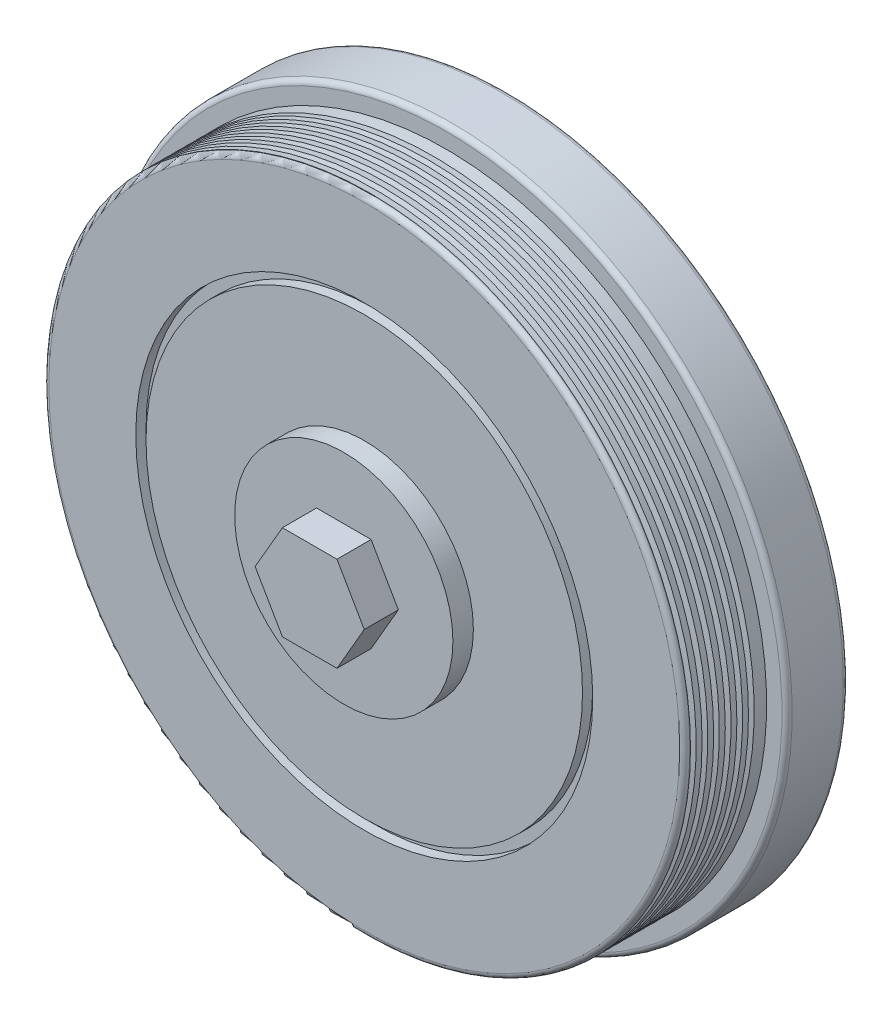
ISO-10303-21;
HEADER;
FILE_DESCRIPTION(('STEP AP214'),'2;1');
FILE_NAME('part.step','',(''),(''),'','','');
FILE_SCHEMA(('AUTOMOTIVE_DESIGN { 1 0 10303 214 1 1 1 1 }'));
ENDSEC;
DATA;
#1=APPLICATION_CONTEXT('core data for automotive mechanical design processes');
#2=APPLICATION_PROTOCOL_DEFINITION('international standard','automotive_design',2000,#1);
#3=PRODUCT_CONTEXT('',#1,'mechanical');
#4=PRODUCT('Part','Part','',(#3));
#5=PRODUCT_RELATED_PRODUCT_CATEGORY('part','',(#4));
#6=PRODUCT_DEFINITION_FORMATION('','',#4);
#7=PRODUCT_DEFINITION_CONTEXT('part definition',#1,'design');
#8=PRODUCT_DEFINITION('design','',#6,#7);
#9=PRODUCT_DEFINITION_SHAPE('','',#8);
#10=(LENGTH_UNIT() NAMED_UNIT(*) SI_UNIT(.MILLI.,.METRE.));
#11=(NAMED_UNIT(*) PLANE_ANGLE_UNIT() SI_UNIT($,.RADIAN.));
#12=(NAMED_UNIT(*) SI_UNIT($,.STERADIAN.) SOLID_ANGLE_UNIT());
#13=UNCERTAINTY_MEASURE_WITH_UNIT(LENGTH_MEASURE(1.E-05),#10,'distance_accuracy_value','');
#14=(GEOMETRIC_REPRESENTATION_CONTEXT(3) GLOBAL_UNCERTAINTY_ASSIGNED_CONTEXT((#13)) GLOBAL_UNIT_ASSIGNED_CONTEXT((#10,
#11,#12)) REPRESENTATION_CONTEXT('',''));
#15=CARTESIAN_POINT('',(0.,0.,0.));
#16=DIRECTION('',(0.,0.,1.));
#17=DIRECTION('',(1.,0.,0.));
#18=AXIS2_PLACEMENT_3D('',#15,#16,#17);
#19=CARTESIAN_POINT('',(0.,92.5,140.));
#20=DIRECTION('',(0.,0.,1.));
#21=DIRECTION('',(1.,0.,0.));
#22=AXIS2_PLACEMENT_3D('',#19,#20,#21);
#23=PLANE('',#22);
#24=CARTESIAN_POINT('',(0.,0.,140.));
#25=DIRECTION('',(0.,0.,1.));
#26=DIRECTION('',(1.,0.,0.));
#27=AXIS2_PLACEMENT_3D('',#24,#25,#26);
#28=CIRCLE('',#27,32.);
#29=CARTESIAN_POINT('',(32.,0.,140.));
#30=VERTEX_POINT('',#29);
#31=EDGE_CURVE('E11',#30,#30,#28,.T.);
#32=ORIENTED_EDGE('',*,*,#31,.F.);
#33=EDGE_LOOP('',(#32));
#34=FACE_BOUND('',#33,.T.);
#35=CARTESIAN_POINT('',(0.,0.,140.));
#36=DIRECTION('',(0.,0.,1.));
#37=DIRECTION('',(1.,0.,0.));
#38=AXIS2_PLACEMENT_3D('',#35,#36,#37);
#39=CIRCLE('',#38,64.);
#40=CARTESIAN_POINT('',(64.,0.,140.));
#41=VERTEX_POINT('',#40);
#42=EDGE_CURVE('E44',#41,#41,#39,.F.);
#43=ORIENTED_EDGE('',*,*,#42,.F.);
#44=EDGE_LOOP('',(#43));
#45=FACE_BOUND('',#44,.T.);
#46=ADVANCED_FACE('F41',(#34,#45),#23,.T.);
#47=CARTESIAN_POINT('',(0.,0.,80.));
#48=DIRECTION('',(0.,0.,-1.));
#49=DIRECTION('',(-1.,0.,0.));
#50=AXIS2_PLACEMENT_3D('',#47,#48,#49);
#51=CYLINDRICAL_SURFACE('',#50,94.);
#52=CARTESIAN_POINT('',(0.,0.,119.666666666667));
#53=DIRECTION('',(0.,0.,-1.));
#54=DIRECTION('',(-1.,0.,0.));
#55=AXIS2_PLACEMENT_3D('',#52,#53,#54);
#56=CIRCLE('',#55,94.);
#57=CARTESIAN_POINT('',(-94.,0.,119.666666666667));
#58=VERTEX_POINT('',#57);
#59=EDGE_CURVE('E154',#58,#58,#56,.F.);
#60=ORIENTED_EDGE('',*,*,#59,.F.);
#61=EDGE_LOOP('',(#60));
#62=FACE_BOUND('',#61,.T.);
#63=CARTESIAN_POINT('',(0.,0.,116.));
#64=DIRECTION('',(0.,0.,-1.));
#65=DIRECTION('',(-1.,0.,0.));
#66=AXIS2_PLACEMENT_3D('',#63,#64,#65);
#67=CIRCLE('',#66,94.);
#68=CARTESIAN_POINT('',(-94.,0.,116.));
#69=VERTEX_POINT('',#68);
#70=EDGE_CURVE('E158',#69,#69,#67,.T.);
#71=ORIENTED_EDGE('',*,*,#70,.F.);
#72=EDGE_LOOP('',(#71));
#73=FACE_BOUND('',#72,.T.);
#74=ADVANCED_FACE('F216',(#62,#73),#51,.T.);
#75=CARTESIAN_POINT('',(0.,0.,80.));
#76=DIRECTION('',(0.,0.,-1.));
#77=DIRECTION('',(-1.,0.,0.));
#78=AXIS2_PLACEMENT_3D('',#75,#76,#77);
#79=CYLINDRICAL_SURFACE('',#78,25.05);
#80=CARTESIAN_POINT('',(0.,0.,98.));
#81=DIRECTION('',(0.,0.,-1.));
#82=DIRECTION('',(-1.,0.,0.));
#83=AXIS2_PLACEMENT_3D('',#80,#81,#82);
#84=CIRCLE('',#83,25.05);
#85=CARTESIAN_POINT('',(-25.05,0.,98.));
#86=VERTEX_POINT('',#85);
#87=EDGE_CURVE('E49',#86,#86,#84,.T.);
#88=ORIENTED_EDGE('',*,*,#87,.T.);
#89=EDGE_LOOP('',(#88));
#90=FACE_BOUND('',#89,.T.);
#91=CARTESIAN_POINT('',(0.,0.,140.));
#92=DIRECTION('',(0.,0.,-1.));
#93=DIRECTION('',(-1.,0.,0.));
#94=AXIS2_PLACEMENT_3D('',#91,#92,#93);
#95=CIRCLE('',#94,25.05);
#96=CARTESIAN_POINT('',(-25.05,0.,140.));
#97=VERTEX_POINT('',#96);
#98=EDGE_CURVE('E150',#97,#97,#95,.T.);
#99=ORIENTED_EDGE('',*,*,#98,.F.);
#100=EDGE_LOOP('',(#99));
#101=FACE_BOUND('',#100,.T.);
#102=ADVANCED_FACE('F43',(#90,#101),#79,.F.);
#103=CARTESIAN_POINT('',(0.,25.05,98.));
#104=DIRECTION('',(0.,0.,-1.));
#105=DIRECTION('',(-1.,0.,0.));
#106=AXIS2_PLACEMENT_3D('',#103,#104,#105);
#107=PLANE('',#106);
#108=CARTESIAN_POINT('',(0.,0.,98.));
#109=DIRECTION('',(0.,0.,-1.));
#110=DIRECTION('',(-1.,0.,0.));
#111=AXIS2_PLACEMENT_3D('',#108,#109,#110);
#112=CIRCLE('',#111,98.5);
#113=CARTESIAN_POINT('',(-98.5,0.,98.));
#114=VERTEX_POINT('',#113);
#115=EDGE_CURVE('E175',#114,#114,#112,.T.);
#116=ORIENTED_EDGE('',*,*,#115,.T.);
#117=EDGE_LOOP('',(#116));
#118=FACE_BOUND('',#117,.T.);
#119=ORIENTED_EDGE('',*,*,#87,.F.);
#120=EDGE_LOOP('',(#119));
#121=FACE_BOUND('',#120,.T.);
#122=ADVANCED_FACE('F594',(#118,#121),#107,.T.);
#123=CARTESIAN_POINT('',(0.,0.,99.5));
#124=DIRECTION('',(0.,0.,-1.));
#125=DIRECTION('',(-1.,0.,0.));
#126=AXIS2_PLACEMENT_3D('',#123,#124,#125);
#127=TOROIDAL_SURFACE('',#126,98.5,1.5);
#128=CARTESIAN_POINT('',(0.,0.,99.5));
#129=DIRECTION('',(0.,0.,-1.));
#130=DIRECTION('',(-1.,0.,0.));
#131=AXIS2_PLACEMENT_3D('',#128,#129,#130);
#132=CIRCLE('',#131,100.);
#133=CARTESIAN_POINT('',(-100.,0.,99.5));
#134=VERTEX_POINT('',#133);
#135=EDGE_CURVE('E169',#134,#134,#132,.T.);
#136=ORIENTED_EDGE('',*,*,#135,.T.);
#137=EDGE_LOOP('',(#136));
#138=FACE_BOUND('',#137,.T.);
#139=ORIENTED_EDGE('',*,*,#115,.F.);
#140=EDGE_LOOP('',(#139));
#141=FACE_BOUND('',#140,.T.);
#142=ADVANCED_FACE('F584',(#138,#141),#127,.T.);
#143=CARTESIAN_POINT('',(0.,0.,80.));
#144=DIRECTION('',(0.,0.,-1.));
#145=DIRECTION('',(-1.,0.,0.));
#146=AXIS2_PLACEMENT_3D('',#143,#144,#145);
#147=CYLINDRICAL_SURFACE('',#146,100.);
#148=CARTESIAN_POINT('',(0.,0.,114.5));
#149=DIRECTION('',(0.,0.,-1.));
#150=DIRECTION('',(-1.,0.,0.));
#151=AXIS2_PLACEMENT_3D('',#148,#149,#150);
#152=CIRCLE('',#151,100.);
#153=CARTESIAN_POINT('',(-100.,0.,114.5));
#154=VERTEX_POINT('',#153);
#155=EDGE_CURVE('E168',#154,#154,#152,.T.);
#156=ORIENTED_EDGE('',*,*,#155,.T.);
#157=EDGE_LOOP('',(#156));
#158=FACE_BOUND('',#157,.T.);
#159=ORIENTED_EDGE('',*,*,#135,.F.);
#160=EDGE_LOOP('',(#159));
#161=FACE_BOUND('',#160,.T.);
#162=ADVANCED_FACE('F573',(#158,#161),#147,.T.);
#163=CARTESIAN_POINT('',(0.,0.,114.5));
#164=DIRECTION('',(0.,0.,-1.));
#165=DIRECTION('',(-1.,0.,0.));
#166=AXIS2_PLACEMENT_3D('',#163,#164,#165);
#167=TOROIDAL_SURFACE('',#166,98.5,1.5);
#168=CARTESIAN_POINT('',(0.,0.,116.));
#169=DIRECTION('',(0.,0.,-1.));
#170=DIRECTION('',(-1.,0.,0.));
#171=AXIS2_PLACEMENT_3D('',#168,#169,#170);
#172=CIRCLE('',#171,98.5);
#173=CARTESIAN_POINT('',(-98.5,0.,116.));
#174=VERTEX_POINT('',#173);
#175=EDGE_CURVE('E161',#174,#174,#172,.T.);
#176=ORIENTED_EDGE('',*,*,#175,.T.);
#177=EDGE_LOOP('',(#176));
#178=FACE_BOUND('',#177,.T.);
#179=ORIENTED_EDGE('',*,*,#155,.F.);
#180=EDGE_LOOP('',(#179));
#181=FACE_BOUND('',#180,.T.);
#182=ADVANCED_FACE('F262',(#178,#181),#167,.T.);
#183=CARTESIAN_POINT('',(0.,98.5,116.));
#184=DIRECTION('',(0.,0.,1.));
#185=DIRECTION('',(1.,0.,0.));
#186=AXIS2_PLACEMENT_3D('',#183,#184,#185);
#187=PLANE('',#186);
#188=ORIENTED_EDGE('',*,*,#70,.T.);
#189=EDGE_LOOP('',(#188));
#190=FACE_BOUND('',#189,.T.);
#191=ORIENTED_EDGE('',*,*,#175,.F.);
#192=EDGE_LOOP('',(#191));
#193=FACE_BOUND('',#192,.T.);
#194=ADVANCED_FACE('F253',(#190,#193),#187,.T.);
#195=CARTESIAN_POINT('',(0.,0.,138.333333333333));
#196=DIRECTION('',(0.,0.,1.));
#197=DIRECTION('',(1.,0.,0.));
#198=AXIS2_PLACEMENT_3D('',#195,#196,#197);
#199=CIRCLE('',#198,94.);
#200=CARTESIAN_POINT('',(94.,0.,138.333333333333));
#201=VERTEX_POINT('',#200);
#202=EDGE_CURVE('E134',#201,#201,#199,.F.);
#203=ORIENTED_EDGE('',*,*,#202,.F.);
#204=EDGE_LOOP('',(#203));
#205=FACE_BOUND('',#204,.T.);
#206=CARTESIAN_POINT('',(0.,0.,138.5));
#207=DIRECTION('',(0.,0.,-1.));
#208=DIRECTION('',(-1.,0.,0.));
#209=AXIS2_PLACEMENT_3D('',#206,#207,#208);
#210=CIRCLE('',#209,94.);
#211=CARTESIAN_POINT('',(-94.,0.,138.5));
#212=VERTEX_POINT('',#211);
#213=EDGE_CURVE('E159',#212,#212,#210,.T.);
#214=ORIENTED_EDGE('',*,*,#213,.T.);
#215=EDGE_LOOP('',(#214));
#216=FACE_BOUND('',#215,.T.);
#217=ADVANCED_FACE('F235',(#205,#216),#51,.T.);
#218=CARTESIAN_POINT('',(0.,0.,138.5));
#219=DIRECTION('',(0.,0.,-1.));
#220=DIRECTION('',(-1.,0.,0.));
#221=AXIS2_PLACEMENT_3D('',#218,#219,#220);
#222=TOROIDAL_SURFACE('',#221,92.5,1.5);
#223=CARTESIAN_POINT('',(0.,0.,140.));
#224=DIRECTION('',(0.,0.,-1.));
#225=DIRECTION('',(-1.,0.,0.));
#226=AXIS2_PLACEMENT_3D('',#223,#224,#225);
#227=CIRCLE('',#226,92.5);
#228=CARTESIAN_POINT('',(-92.5,0.,140.));
#229=VERTEX_POINT('',#228);
#230=EDGE_CURVE('E153',#229,#229,#227,.T.);
#231=ORIENTED_EDGE('',*,*,#230,.T.);
#232=EDGE_LOOP('',(#231));
#233=FACE_BOUND('',#232,.T.);
#234=ORIENTED_EDGE('',*,*,#213,.F.);
#235=EDGE_LOOP('',(#234));
#236=FACE_BOUND('',#235,.T.);
#237=ADVANCED_FACE('F238',(#233,#236),#222,.T.);
#238=CARTESIAN_POINT('',(0.,0.,140.));
#239=DIRECTION('',(0.,0.,1.));
#240=DIRECTION('',(1.,0.,0.));
#241=AXIS2_PLACEMENT_3D('',#238,#239,#240);
#242=CIRCLE('',#241,67.);
#243=CARTESIAN_POINT('',(67.,0.,140.));
#244=VERTEX_POINT('',#243);
#245=EDGE_CURVE('E130',#244,#244,#242,.T.);
#246=ORIENTED_EDGE('',*,*,#245,.F.);
#247=EDGE_LOOP('',(#246));
#248=FACE_BOUND('',#247,.T.);
#249=ORIENTED_EDGE('',*,*,#230,.F.);
#250=EDGE_LOOP('',(#249));
#251=FACE_BOUND('',#250,.T.);
#252=ADVANCED_FACE('F225',(#248,#251),#23,.T.);
#253=CARTESIAN_POINT('',(0.,0.,137.5));
#254=DIRECTION('',(0.,0.,-1.));
#255=DIRECTION('',(-1.,0.,0.));
#256=AXIS2_PLACEMENT_3D('',#253,#254,#255);
#257=CONICAL_SURFACE('',#256,91.5,1.24904577239825);
#258=CARTESIAN_POINT('',(0.,0.,136.666666666667));
#259=DIRECTION('',(0.,0.,-1.));
#260=DIRECTION('',(-1.,0.,0.));
#261=AXIS2_PLACEMENT_3D('',#258,#259,#260);
#262=CIRCLE('',#261,94.);
#263=CARTESIAN_POINT('',(-94.,0.,136.666666666667));
#264=VERTEX_POINT('',#263);
#265=EDGE_CURVE('E177',#264,#264,#262,.F.);
#266=ORIENTED_EDGE('',*,*,#265,.T.);
#267=EDGE_LOOP('',(#266));
#268=FACE_BOUND('',#267,.T.);
#269=CARTESIAN_POINT('',(0.,0.,137.5));
#270=DIRECTION('',(0.,0.,-1.));
#271=DIRECTION('',(-1.,0.,0.));
#272=AXIS2_PLACEMENT_3D('',#269,#270,#271);
#273=CIRCLE('',#272,91.5);
#274=CARTESIAN_POINT('',(-91.5,0.,137.5));
#275=VERTEX_POINT('',#274);
#276=EDGE_CURVE('E147',#275,#275,#273,.T.);
#277=ORIENTED_EDGE('',*,*,#276,.T.);
#278=EDGE_LOOP('',(#277));
#279=FACE_BOUND('',#278,.T.);
#280=ADVANCED_FACE('F240',(#268,#279),#257,.T.);
#281=CARTESIAN_POINT('',(0.,0.,139.));
#282=DIRECTION('',(0.,0.,1.));
#283=DIRECTION('',(1.,0.,0.));
#284=AXIS2_PLACEMENT_3D('',#281,#282,#283);
#285=CONICAL_SURFACE('',#284,96.,1.24904577239825);
#286=ORIENTED_EDGE('',*,*,#202,.T.);
#287=EDGE_LOOP('',(#286));
#288=FACE_BOUND('',#287,.T.);
#289=ORIENTED_EDGE('',*,*,#276,.F.);
#290=EDGE_LOOP('',(#289));
#291=FACE_BOUND('',#290,.T.);
#292=ADVANCED_FACE('F244',(#288,#291),#285,.T.);
#293=CARTESIAN_POINT('',(0.,0.,134.933333333333));
#294=DIRECTION('',(0.,0.,1.));
#295=DIRECTION('',(1.,0.,0.));
#296=AXIS2_PLACEMENT_3D('',#293,#294,#295);
#297=CIRCLE('',#296,94.);
#298=CARTESIAN_POINT('',(94.,0.,134.933333333333));
#299=VERTEX_POINT('',#298);
#300=EDGE_CURVE('E185',#299,#299,#297,.F.);
#301=ORIENTED_EDGE('',*,*,#300,.F.);
#302=EDGE_LOOP('',(#301));
#303=FACE_BOUND('',#302,.T.);
#304=ORIENTED_EDGE('',*,*,#265,.F.);
#305=EDGE_LOOP('',(#304));
#306=FACE_BOUND('',#305,.T.);
#307=ADVANCED_FACE('F257',(#303,#306),#51,.T.);
#308=CARTESIAN_POINT('',(0.,0.,134.1));
#309=DIRECTION('',(0.,0.,-1.));
#310=DIRECTION('',(-1.,0.,0.));
#311=AXIS2_PLACEMENT_3D('',#308,#309,#310);
#312=CONICAL_SURFACE('',#311,91.5,1.24904577239825);
#313=CARTESIAN_POINT('',(0.,0.,133.266666666667));
#314=DIRECTION('',(0.,0.,-1.));
#315=DIRECTION('',(-1.,0.,0.));
#316=AXIS2_PLACEMENT_3D('',#313,#314,#315);
#317=CIRCLE('',#316,94.);
#318=CARTESIAN_POINT('',(-94.,0.,133.266666666667));
#319=VERTEX_POINT('',#318);
#320=EDGE_CURVE('E184',#319,#319,#317,.F.);
#321=ORIENTED_EDGE('',*,*,#320,.T.);
#322=EDGE_LOOP('',(#321));
#323=FACE_BOUND('',#322,.T.);
#324=CARTESIAN_POINT('',(0.,0.,134.1));
#325=DIRECTION('',(0.,0.,-1.));
#326=DIRECTION('',(-1.,0.,0.));
#327=AXIS2_PLACEMENT_3D('',#324,#325,#326);
#328=CIRCLE('',#327,91.5);
#329=CARTESIAN_POINT('',(-91.5,0.,134.1));
#330=VERTEX_POINT('',#329);
#331=EDGE_CURVE('E144',#330,#330,#328,.T.);
#332=ORIENTED_EDGE('',*,*,#331,.T.);
#333=EDGE_LOOP('',(#332));
#334=FACE_BOUND('',#333,.T.);
#335=ADVANCED_FACE('F267',(#323,#334),#312,.T.);
#336=CARTESIAN_POINT('',(0.,0.,135.6));
#337=DIRECTION('',(0.,0.,1.));
#338=DIRECTION('',(1.,0.,0.));
#339=AXIS2_PLACEMENT_3D('',#336,#337,#338);
#340=CONICAL_SURFACE('',#339,96.,1.24904577239825);
#341=ORIENTED_EDGE('',*,*,#300,.T.);
#342=EDGE_LOOP('',(#341));
#343=FACE_BOUND('',#342,.T.);
#344=ORIENTED_EDGE('',*,*,#331,.F.);
#345=EDGE_LOOP('',(#344));
#346=FACE_BOUND('',#345,.T.);
#347=ADVANCED_FACE('F271',(#343,#346),#340,.T.);
#348=CARTESIAN_POINT('',(0.,0.,131.533333333333));
#349=DIRECTION('',(0.,0.,1.));
#350=DIRECTION('',(1.,0.,0.));
#351=AXIS2_PLACEMENT_3D('',#348,#349,#350);
#352=CIRCLE('',#351,94.);
#353=CARTESIAN_POINT('',(94.,0.,131.533333333333));
#354=VERTEX_POINT('',#353);
#355=EDGE_CURVE('E189',#354,#354,#352,.F.);
#356=ORIENTED_EDGE('',*,*,#355,.F.);
#357=EDGE_LOOP('',(#356));
#358=FACE_BOUND('',#357,.T.);
#359=ORIENTED_EDGE('',*,*,#320,.F.);
#360=EDGE_LOOP('',(#359));
#361=FACE_BOUND('',#360,.T.);
#362=ADVANCED_FACE('F270',(#358,#361),#51,.T.);
#363=CARTESIAN_POINT('',(0.,0.,130.7));
#364=DIRECTION('',(0.,0.,-1.));
#365=DIRECTION('',(-1.,0.,0.));
#366=AXIS2_PLACEMENT_3D('',#363,#364,#365);
#367=CONICAL_SURFACE('',#366,91.5,1.24904577239825);
#368=CARTESIAN_POINT('',(0.,0.,129.866666666667));
#369=DIRECTION('',(0.,0.,-1.));
#370=DIRECTION('',(-1.,0.,0.));
#371=AXIS2_PLACEMENT_3D('',#368,#369,#370);
#372=CIRCLE('',#371,94.);
#373=CARTESIAN_POINT('',(-94.,0.,129.866666666667));
#374=VERTEX_POINT('',#373);
#375=EDGE_CURVE('E191',#374,#374,#372,.F.);
#376=ORIENTED_EDGE('',*,*,#375,.T.);
#377=EDGE_LOOP('',(#376));
#378=FACE_BOUND('',#377,.T.);
#379=CARTESIAN_POINT('',(0.,0.,130.7));
#380=DIRECTION('',(0.,0.,-1.));
#381=DIRECTION('',(-1.,0.,0.));
#382=AXIS2_PLACEMENT_3D('',#379,#380,#381);
#383=CIRCLE('',#382,91.5);
#384=CARTESIAN_POINT('',(-91.5,0.,130.7));
#385=VERTEX_POINT('',#384);
#386=EDGE_CURVE('E142',#385,#385,#383,.T.);
#387=ORIENTED_EDGE('',*,*,#386,.T.);
#388=EDGE_LOOP('',(#387));
#389=FACE_BOUND('',#388,.T.);
#390=ADVANCED_FACE('F282',(#378,#389),#367,.T.);
#391=CARTESIAN_POINT('',(0.,0.,132.2));
#392=DIRECTION('',(0.,0.,1.));
#393=DIRECTION('',(1.,0.,0.));
#394=AXIS2_PLACEMENT_3D('',#391,#392,#393);
#395=CONICAL_SURFACE('',#394,96.,1.24904577239825);
#396=ORIENTED_EDGE('',*,*,#355,.T.);
#397=EDGE_LOOP('',(#396));
#398=FACE_BOUND('',#397,.T.);
#399=ORIENTED_EDGE('',*,*,#386,.F.);
#400=EDGE_LOOP('',(#399));
#401=FACE_BOUND('',#400,.T.);
#402=ADVANCED_FACE('F290',(#398,#401),#395,.T.);
#403=CARTESIAN_POINT('',(0.,0.,128.133333333333));
#404=DIRECTION('',(0.,0.,1.));
#405=DIRECTION('',(1.,0.,0.));
#406=AXIS2_PLACEMENT_3D('',#403,#404,#405);
#407=CIRCLE('',#406,94.);
#408=CARTESIAN_POINT('',(94.,0.,128.133333333333));
#409=VERTEX_POINT('',#408);
#410=EDGE_CURVE('E193',#409,#409,#407,.F.);
#411=ORIENTED_EDGE('',*,*,#410,.F.);
#412=EDGE_LOOP('',(#411));
#413=FACE_BOUND('',#412,.T.);
#414=ORIENTED_EDGE('',*,*,#375,.F.);
#415=EDGE_LOOP('',(#414));
#416=FACE_BOUND('',#415,.T.);
#417=ADVANCED_FACE('F283',(#413,#416),#51,.T.);
#418=CARTESIAN_POINT('',(0.,0.,127.3));
#419=DIRECTION('',(0.,0.,-1.));
#420=DIRECTION('',(-1.,0.,0.));
#421=AXIS2_PLACEMENT_3D('',#418,#419,#420);
#422=CONICAL_SURFACE('',#421,91.5,1.24904577239825);
#423=CARTESIAN_POINT('',(0.,0.,126.466666666667));
#424=DIRECTION('',(0.,0.,-1.));
#425=DIRECTION('',(-1.,0.,0.));
#426=AXIS2_PLACEMENT_3D('',#423,#424,#425);
#427=CIRCLE('',#426,94.);
#428=CARTESIAN_POINT('',(-94.,0.,126.466666666667));
#429=VERTEX_POINT('',#428);
#430=EDGE_CURVE('E200',#429,#429,#427,.F.);
#431=ORIENTED_EDGE('',*,*,#430,.T.);
#432=EDGE_LOOP('',(#431));
#433=FACE_BOUND('',#432,.T.);
#434=CARTESIAN_POINT('',(0.,0.,127.3));
#435=DIRECTION('',(0.,0.,-1.));
#436=DIRECTION('',(-1.,0.,0.));
#437=AXIS2_PLACEMENT_3D('',#434,#435,#436);
#438=CIRCLE('',#437,91.5);
#439=CARTESIAN_POINT('',(-91.5,0.,127.3));
#440=VERTEX_POINT('',#439);
#441=EDGE_CURVE('E140',#440,#440,#438,.T.);
#442=ORIENTED_EDGE('',*,*,#441,.T.);
#443=EDGE_LOOP('',(#442));
#444=FACE_BOUND('',#443,.T.);
#445=ADVANCED_FACE('F298',(#433,#444),#422,.T.);
#446=CARTESIAN_POINT('',(0.,0.,128.8));
#447=DIRECTION('',(0.,0.,1.));
#448=DIRECTION('',(1.,0.,0.));
#449=AXIS2_PLACEMENT_3D('',#446,#447,#448);
#450=CONICAL_SURFACE('',#449,96.,1.24904577239825);
#451=ORIENTED_EDGE('',*,*,#410,.T.);
#452=EDGE_LOOP('',(#451));
#453=FACE_BOUND('',#452,.T.);
#454=ORIENTED_EDGE('',*,*,#441,.F.);
#455=EDGE_LOOP('',(#454));
#456=FACE_BOUND('',#455,.T.);
#457=ADVANCED_FACE('F303',(#453,#456),#450,.T.);
#458=CARTESIAN_POINT('',(0.,0.,124.733333333333));
#459=DIRECTION('',(0.,0.,1.));
#460=DIRECTION('',(1.,0.,0.));
#461=AXIS2_PLACEMENT_3D('',#458,#459,#460);
#462=CIRCLE('',#461,94.);
#463=CARTESIAN_POINT('',(94.,0.,124.733333333333));
#464=VERTEX_POINT('',#463);
#465=EDGE_CURVE('E196',#464,#464,#462,.F.);
#466=ORIENTED_EDGE('',*,*,#465,.F.);
#467=EDGE_LOOP('',(#466));
#468=FACE_BOUND('',#467,.T.);
#469=ORIENTED_EDGE('',*,*,#430,.F.);
#470=EDGE_LOOP('',(#469));
#471=FACE_BOUND('',#470,.T.);
#472=ADVANCED_FACE('F296',(#468,#471),#51,.T.);
#473=CARTESIAN_POINT('',(0.,0.,123.9));
#474=DIRECTION('',(0.,0.,-1.));
#475=DIRECTION('',(-1.,0.,0.));
#476=AXIS2_PLACEMENT_3D('',#473,#474,#475);
#477=CONICAL_SURFACE('',#476,91.5,1.24904577239825);
#478=CARTESIAN_POINT('',(0.,0.,123.066666666667));
#479=DIRECTION('',(0.,0.,-1.));
#480=DIRECTION('',(-1.,0.,0.));
#481=AXIS2_PLACEMENT_3D('',#478,#479,#480);
#482=CIRCLE('',#481,94.);
#483=CARTESIAN_POINT('',(-94.,0.,123.066666666667));
#484=VERTEX_POINT('',#483);
#485=EDGE_CURVE('E205',#484,#484,#482,.F.);
#486=ORIENTED_EDGE('',*,*,#485,.T.);
#487=EDGE_LOOP('',(#486));
#488=FACE_BOUND('',#487,.T.);
#489=CARTESIAN_POINT('',(0.,0.,123.9));
#490=DIRECTION('',(0.,0.,-1.));
#491=DIRECTION('',(-1.,0.,0.));
#492=AXIS2_PLACEMENT_3D('',#489,#490,#491);
#493=CIRCLE('',#492,91.5);
#494=CARTESIAN_POINT('',(-91.5,0.,123.9));
#495=VERTEX_POINT('',#494);
#496=EDGE_CURVE('E131',#495,#495,#493,.T.);
#497=ORIENTED_EDGE('',*,*,#496,.T.);
#498=EDGE_LOOP('',(#497));
#499=FACE_BOUND('',#498,.T.);
#500=ADVANCED_FACE('F311',(#488,#499),#477,.T.);
#501=CARTESIAN_POINT('',(0.,0.,125.4));
#502=DIRECTION('',(0.,0.,1.));
#503=DIRECTION('',(1.,0.,0.));
#504=AXIS2_PLACEMENT_3D('',#501,#502,#503);
#505=CONICAL_SURFACE('',#504,96.,1.24904577239825);
#506=ORIENTED_EDGE('',*,*,#465,.T.);
#507=EDGE_LOOP('',(#506));
#508=FACE_BOUND('',#507,.T.);
#509=ORIENTED_EDGE('',*,*,#496,.F.);
#510=EDGE_LOOP('',(#509));
#511=FACE_BOUND('',#510,.T.);
#512=ADVANCED_FACE('F320',(#508,#511),#505,.T.);
#513=CARTESIAN_POINT('',(0.,0.,121.333333333333));
#514=DIRECTION('',(0.,0.,1.));
#515=DIRECTION('',(1.,0.,0.));
#516=AXIS2_PLACEMENT_3D('',#513,#514,#515);
#517=CIRCLE('',#516,94.);
#518=CARTESIAN_POINT('',(94.,0.,121.333333333333));
#519=VERTEX_POINT('',#518);
#520=EDGE_CURVE('E207',#519,#519,#517,.F.);
#521=ORIENTED_EDGE('',*,*,#520,.F.);
#522=EDGE_LOOP('',(#521));
#523=FACE_BOUND('',#522,.T.);
#524=ORIENTED_EDGE('',*,*,#485,.F.);
#525=EDGE_LOOP('',(#524));
#526=FACE_BOUND('',#525,.T.);
#527=ADVANCED_FACE('F233',(#523,#526),#51,.T.);
#528=CARTESIAN_POINT('',(0.,0.,120.5));
#529=DIRECTION('',(0.,0.,-1.));
#530=DIRECTION('',(-1.,0.,0.));
#531=AXIS2_PLACEMENT_3D('',#528,#529,#530);
#532=CONICAL_SURFACE('',#531,91.5,1.24904577239826);
#533=ORIENTED_EDGE('',*,*,#59,.T.);
#534=EDGE_LOOP('',(#533));
#535=FACE_BOUND('',#534,.T.);
#536=CARTESIAN_POINT('',(0.,0.,120.5));
#537=DIRECTION('',(0.,0.,-1.));
#538=DIRECTION('',(-1.,0.,0.));
#539=AXIS2_PLACEMENT_3D('',#536,#537,#538);
#540=CIRCLE('',#539,91.5);
#541=CARTESIAN_POINT('',(-91.5,0.,120.5));
#542=VERTEX_POINT('',#541);
#543=EDGE_CURVE('E132',#542,#542,#540,.T.);
#544=ORIENTED_EDGE('',*,*,#543,.T.);
#545=EDGE_LOOP('',(#544));
#546=FACE_BOUND('',#545,.T.);
#547=ADVANCED_FACE('F325',(#535,#546),#532,.T.);
#548=CARTESIAN_POINT('',(0.,0.,122.));
#549=DIRECTION('',(0.,0.,1.));
#550=DIRECTION('',(1.,0.,0.));
#551=AXIS2_PLACEMENT_3D('',#548,#549,#550);
#552=CONICAL_SURFACE('',#551,96.,1.24904577239825);
#553=ORIENTED_EDGE('',*,*,#520,.T.);
#554=EDGE_LOOP('',(#553));
#555=FACE_BOUND('',#554,.T.);
#556=ORIENTED_EDGE('',*,*,#543,.F.);
#557=EDGE_LOOP('',(#556));
#558=FACE_BOUND('',#557,.T.);
#559=ADVANCED_FACE('F332',(#555,#558),#552,.T.);
#560=CARTESIAN_POINT('',(0.,0.,80.));
#561=DIRECTION('',(0.,0.,-1.));
#562=DIRECTION('',(-1.,0.,0.));
#563=AXIS2_PLACEMENT_3D('',#560,#561,#562);
#564=CYLINDRICAL_SURFACE('',#563,64.);
#565=ORIENTED_EDGE('',*,*,#42,.T.);
#566=EDGE_LOOP('',(#565));
#567=FACE_BOUND('',#566,.T.);
#568=CARTESIAN_POINT('',(0.,0.,137.));
#569=DIRECTION('',(0.,0.,-1.));
#570=DIRECTION('',(-1.,0.,0.));
#571=AXIS2_PLACEMENT_3D('',#568,#569,#570);
#572=CIRCLE('',#571,64.);
#573=CARTESIAN_POINT('',(-64.,0.,137.));
#574=VERTEX_POINT('',#573);
#575=EDGE_CURVE('E127',#574,#574,#572,.T.);
#576=ORIENTED_EDGE('',*,*,#575,.F.);
#577=EDGE_LOOP('',(#576));
#578=FACE_BOUND('',#577,.T.);
#579=ADVANCED_FACE('F217',(#567,#578),#564,.T.);
#580=CARTESIAN_POINT('',(0.,64.,137.));
#581=DIRECTION('',(0.,0.,-1.));
#582=DIRECTION('',(-1.,0.,0.));
#583=AXIS2_PLACEMENT_3D('',#580,#581,#582);
#584=PLANE('',#583);
#585=CARTESIAN_POINT('',(0.,0.,137.));
#586=DIRECTION('',(0.,0.,-1.));
#587=DIRECTION('',(-1.,0.,0.));
#588=AXIS2_PLACEMENT_3D('',#585,#586,#587);
#589=CIRCLE('',#588,67.);
#590=CARTESIAN_POINT('',(-67.,0.,137.));
#591=VERTEX_POINT('',#590);
#592=EDGE_CURVE('E118',#591,#591,#589,.T.);
#593=ORIENTED_EDGE('',*,*,#592,.F.);
#594=EDGE_LOOP('',(#593));
#595=FACE_BOUND('',#594,.T.);
#596=ORIENTED_EDGE('',*,*,#575,.T.);
#597=EDGE_LOOP('',(#596));
#598=FACE_BOUND('',#597,.T.);
#599=ADVANCED_FACE('F349',(#595,#598),#584,.F.);
#600=CARTESIAN_POINT('',(0.,0.,80.));
#601=DIRECTION('',(0.,0.,-1.));
#602=DIRECTION('',(-1.,0.,0.));
#603=AXIS2_PLACEMENT_3D('',#600,#601,#602);
#604=CYLINDRICAL_SURFACE('',#603,67.);
#605=ORIENTED_EDGE('',*,*,#245,.T.);
#606=EDGE_LOOP('',(#605));
#607=FACE_BOUND('',#606,.T.);
#608=ORIENTED_EDGE('',*,*,#592,.T.);
#609=EDGE_LOOP('',(#608));
#610=FACE_BOUND('',#609,.T.);
#611=ADVANCED_FACE('F351',(#607,#610),#604,.F.);
#612=CARTESIAN_POINT('',(0.,0.,146.));
#613=DIRECTION('',(0.,0.,1.));
#614=DIRECTION('',(1.,0.,0.));
#615=AXIS2_PLACEMENT_3D('',#612,#613,#614);
#616=PLANE('',#615);
#617=DIRECTION('',(0.5,0.866025403784439,0.));
#618=VECTOR('',#617,1.);
#619=CARTESIAN_POINT('',(8.,-13.856406460551,146.));
#620=LINE('',#619,#618);
#621=CARTESIAN_POINT('',(8.,-13.856406460551,146.));
#622=VERTEX_POINT('',#621);
#623=CARTESIAN_POINT('',(16.,0.,146.));
#624=VERTEX_POINT('',#623);
#625=EDGE_CURVE('E59',#622,#624,#620,.T.);
#626=ORIENTED_EDGE('',*,*,#625,.F.);
#627=DIRECTION('',(1.,0.,0.));
#628=VECTOR('',#627,1.);
#629=CARTESIAN_POINT('',(-8.00000000000001,-13.856406460551,146.));
#630=LINE('',#629,#628);
#631=CARTESIAN_POINT('',(-8.00000000000001,-13.856406460551,146.));
#632=VERTEX_POINT('',#631);
#633=EDGE_CURVE('E62',#632,#622,#630,.T.);
#634=ORIENTED_EDGE('',*,*,#633,.F.);
#635=DIRECTION('',(0.5,-0.866025403784439,0.));
#636=VECTOR('',#635,1.);
#637=CARTESIAN_POINT('',(-16.,0.,146.));
#638=LINE('',#637,#636);
#639=CARTESIAN_POINT('',(-16.,0.,146.));
#640=VERTEX_POINT('',#639);
#641=EDGE_CURVE('E649',#640,#632,#638,.T.);
#642=ORIENTED_EDGE('',*,*,#641,.F.);
#643=DIRECTION('',(-0.5,-0.866025403784439,0.));
#644=VECTOR('',#643,1.);
#645=CARTESIAN_POINT('',(-8.,13.856406460551,146.));
#646=LINE('',#645,#644);
#647=CARTESIAN_POINT('',(-8.,13.856406460551,146.));
#648=VERTEX_POINT('',#647);
#649=EDGE_CURVE('E661',#648,#640,#646,.T.);
#650=ORIENTED_EDGE('',*,*,#649,.F.);
#651=DIRECTION('',(-1.,0.,0.));
#652=VECTOR('',#651,1.);
#653=CARTESIAN_POINT('',(8.,13.856406460551,146.));
#654=LINE('',#653,#652);
#655=CARTESIAN_POINT('',(8.,13.856406460551,146.));
#656=VERTEX_POINT('',#655);
#657=EDGE_CURVE('E666',#656,#648,#654,.T.);
#658=ORIENTED_EDGE('',*,*,#657,.F.);
#659=DIRECTION('',(-0.5,0.866025403784439,0.));
#660=VECTOR('',#659,1.);
#661=CARTESIAN_POINT('',(16.,0.,146.));
#662=LINE('',#661,#660);
#663=EDGE_CURVE('E667',#624,#656,#662,.T.);
#664=ORIENTED_EDGE('',*,*,#663,.F.);
#665=EDGE_LOOP('',(#626,#634,#642,#650,#658,#664));
#666=FACE_BOUND('',#665,.T.);
#667=CARTESIAN_POINT('',(0.,0.,146.));
#668=DIRECTION('',(0.,0.,1.));
#669=DIRECTION('',(1.,0.,0.));
#670=AXIS2_PLACEMENT_3D('',#667,#668,#669);
#671=CIRCLE('',#670,32.);
#672=CARTESIAN_POINT('',(32.,0.,146.));
#673=VERTEX_POINT('',#672);
#674=EDGE_CURVE('E116',#673,#673,#671,.T.);
#675=ORIENTED_EDGE('',*,*,#674,.T.);
#676=EDGE_LOOP('',(#675));
#677=FACE_BOUND('',#676,.T.);
#678=ADVANCED_FACE('F357',(#666,#677),#616,.T.);
#679=CARTESIAN_POINT('',(0.,0.,146.));
#680=DIRECTION('',(0.,0.,-1.));
#681=DIRECTION('',(-1.,0.,0.));
#682=AXIS2_PLACEMENT_3D('',#679,#680,#681);
#683=CYLINDRICAL_SURFACE('',#682,32.);
#684=ORIENTED_EDGE('',*,*,#674,.F.);
#685=EDGE_LOOP('',(#684));
#686=FACE_BOUND('',#685,.T.);
#687=ORIENTED_EDGE('',*,*,#31,.T.);
#688=EDGE_LOOP('',(#687));
#689=FACE_BOUND('',#688,.T.);
#690=ADVANCED_FACE('F356',(#686,#689),#683,.T.);
#691=CARTESIAN_POINT('',(0.,0.,140.));
#692=DIRECTION('',(0.,0.,1.));
#693=DIRECTION('',(1.,0.,0.));
#694=AXIS2_PLACEMENT_3D('',#691,#692,#693);
#695=PLANE('',#694);
#696=ORIENTED_EDGE('',*,*,#98,.T.);
#697=EDGE_LOOP('',(#696));
#698=FACE_BOUND('',#697,.T.);
#699=ADVANCED_FACE('F359',(#698),#695,.F.);
#700=CARTESIAN_POINT('',(8.,-13.856406460551,156.));
#701=DIRECTION('',(-0.866025403784439,0.5,0.));
#702=DIRECTION('',(-0.5,-0.866025403784439,0.));
#703=AXIS2_PLACEMENT_3D('',#700,#701,#702);
#704=PLANE('',#703);
#705=ORIENTED_EDGE('',*,*,#625,.T.);
#706=DIRECTION('',(0.,0.,-1.));
#707=VECTOR('',#706,1.);
#708=CARTESIAN_POINT('',(16.,0.,156.));
#709=LINE('',#708,#707);
#710=CARTESIAN_POINT('',(16.,0.,156.));
#711=VERTEX_POINT('',#710);
#712=EDGE_CURVE('E100',#711,#624,#709,.T.);
#713=ORIENTED_EDGE('',*,*,#712,.F.);
#714=DIRECTION('',(0.5,0.866025403784439,0.));
#715=VECTOR('',#714,1.);
#716=CARTESIAN_POINT('',(8.,-13.856406460551,156.));
#717=LINE('',#716,#715);
#718=CARTESIAN_POINT('',(8.,-13.856406460551,156.));
#719=VERTEX_POINT('',#718);
#720=EDGE_CURVE('E102',#719,#711,#717,.T.);
#721=ORIENTED_EDGE('',*,*,#720,.F.);
#722=DIRECTION('',(0.,0.,-1.));
#723=VECTOR('',#722,1.);
#724=CARTESIAN_POINT('',(8.,-13.856406460551,156.));
#725=LINE('',#724,#723);
#726=EDGE_CURVE('E643',#719,#622,#725,.T.);
#727=ORIENTED_EDGE('',*,*,#726,.T.);
#728=EDGE_LOOP('',(#705,#713,#721,#727));
#729=FACE_BOUND('',#728,.T.);
#730=ADVANCED_FACE('F114',(#729),#704,.F.);
#731=CARTESIAN_POINT('',(16.,0.,156.));
#732=DIRECTION('',(-0.866025403784439,-0.5,0.));
#733=DIRECTION('',(0.5,-0.866025403784439,0.));
#734=AXIS2_PLACEMENT_3D('',#731,#732,#733);
#735=PLANE('',#734);
#736=ORIENTED_EDGE('',*,*,#663,.T.);
#737=DIRECTION('',(0.,0.,-1.));
#738=VECTOR('',#737,1.);
#739=CARTESIAN_POINT('',(8.,13.856406460551,156.));
#740=LINE('',#739,#738);
#741=CARTESIAN_POINT('',(8.,13.856406460551,156.));
#742=VERTEX_POINT('',#741);
#743=EDGE_CURVE('E103',#742,#656,#740,.T.);
#744=ORIENTED_EDGE('',*,*,#743,.F.);
#745=DIRECTION('',(-0.5,0.866025403784439,0.));
#746=VECTOR('',#745,1.);
#747=CARTESIAN_POINT('',(16.,0.,156.));
#748=LINE('',#747,#746);
#749=EDGE_CURVE('E91',#711,#742,#748,.T.);
#750=ORIENTED_EDGE('',*,*,#749,.F.);
#751=ORIENTED_EDGE('',*,*,#712,.T.);
#752=EDGE_LOOP('',(#736,#744,#750,#751));
#753=FACE_BOUND('',#752,.T.);
#754=ADVANCED_FACE('F97',(#753),#735,.F.);
#755=CARTESIAN_POINT('',(8.,13.856406460551,156.));
#756=DIRECTION('',(0.,-1.,0.));
#757=DIRECTION('',(1.,0.,0.));
#758=AXIS2_PLACEMENT_3D('',#755,#756,#757);
#759=PLANE('',#758);
#760=ORIENTED_EDGE('',*,*,#657,.T.);
#761=DIRECTION('',(0.,0.,-1.));
#762=VECTOR('',#761,1.);
#763=CARTESIAN_POINT('',(-8.,13.856406460551,156.));
#764=LINE('',#763,#762);
#765=CARTESIAN_POINT('',(-8.,13.856406460551,156.));
#766=VERTEX_POINT('',#765);
#767=EDGE_CURVE('E122',#766,#648,#764,.T.);
#768=ORIENTED_EDGE('',*,*,#767,.F.);
#769=DIRECTION('',(-1.,0.,0.));
#770=VECTOR('',#769,1.);
#771=CARTESIAN_POINT('',(8.,13.856406460551,156.));
#772=LINE('',#771,#770);
#773=EDGE_CURVE('E104',#742,#766,#772,.T.);
#774=ORIENTED_EDGE('',*,*,#773,.F.);
#775=ORIENTED_EDGE('',*,*,#743,.T.);
#776=EDGE_LOOP('',(#760,#768,#774,#775));
#777=FACE_BOUND('',#776,.T.);
#778=ADVANCED_FACE('F371',(#777),#759,.F.);
#779=CARTESIAN_POINT('',(-8.,13.856406460551,156.));
#780=DIRECTION('',(0.866025403784438,-0.5,0.));
#781=DIRECTION('',(0.5,0.866025403784439,0.));
#782=AXIS2_PLACEMENT_3D('',#779,#780,#781);
#783=PLANE('',#782);
#784=ORIENTED_EDGE('',*,*,#649,.T.);
#785=DIRECTION('',(0.,0.,-1.));
#786=VECTOR('',#785,1.);
#787=CARTESIAN_POINT('',(-16.,0.,156.));
#788=LINE('',#787,#786);
#789=CARTESIAN_POINT('',(-16.,0.,156.));
#790=VERTEX_POINT('',#789);
#791=EDGE_CURVE('E652',#790,#640,#788,.T.);
#792=ORIENTED_EDGE('',*,*,#791,.F.);
#793=DIRECTION('',(-0.5,-0.866025403784439,0.));
#794=VECTOR('',#793,1.);
#795=CARTESIAN_POINT('',(-8.,13.856406460551,156.));
#796=LINE('',#795,#794);
#797=EDGE_CURVE('E664',#766,#790,#796,.T.);
#798=ORIENTED_EDGE('',*,*,#797,.F.);
#799=ORIENTED_EDGE('',*,*,#767,.T.);
#800=EDGE_LOOP('',(#784,#792,#798,#799));
#801=FACE_BOUND('',#800,.T.);
#802=ADVANCED_FACE('F372',(#801),#783,.F.);
#803=CARTESIAN_POINT('',(-16.,0.,156.));
#804=DIRECTION('',(0.866025403784439,0.5,0.));
#805=DIRECTION('',(-0.5,0.866025403784439,0.));
#806=AXIS2_PLACEMENT_3D('',#803,#804,#805);
#807=PLANE('',#806);
#808=ORIENTED_EDGE('',*,*,#641,.T.);
#809=DIRECTION('',(0.,0.,-1.));
#810=VECTOR('',#809,1.);
#811=CARTESIAN_POINT('',(-8.00000000000001,-13.856406460551,156.));
#812=LINE('',#811,#810);
#813=CARTESIAN_POINT('',(-8.00000000000001,-13.856406460551,156.));
#814=VERTEX_POINT('',#813);
#815=EDGE_CURVE('E647',#814,#632,#812,.T.);
#816=ORIENTED_EDGE('',*,*,#815,.F.);
#817=DIRECTION('',(0.5,-0.866025403784439,0.));
#818=VECTOR('',#817,1.);
#819=CARTESIAN_POINT('',(-16.,0.,156.));
#820=LINE('',#819,#818);
#821=EDGE_CURVE('E653',#790,#814,#820,.T.);
#822=ORIENTED_EDGE('',*,*,#821,.F.);
#823=ORIENTED_EDGE('',*,*,#791,.T.);
#824=EDGE_LOOP('',(#808,#816,#822,#823));
#825=FACE_BOUND('',#824,.T.);
#826=ADVANCED_FACE('F377',(#825),#807,.F.);
#827=CARTESIAN_POINT('',(-8.00000000000001,-13.856406460551,156.));
#828=DIRECTION('',(0.,1.,0.));
#829=DIRECTION('',(-1.,0.,0.));
#830=AXIS2_PLACEMENT_3D('',#827,#828,#829);
#831=PLANE('',#830);
#832=ORIENTED_EDGE('',*,*,#633,.T.);
#833=ORIENTED_EDGE('',*,*,#726,.F.);
#834=DIRECTION('',(1.,0.,0.));
#835=VECTOR('',#834,1.);
#836=CARTESIAN_POINT('',(-8.00000000000001,-13.856406460551,156.));
#837=LINE('',#836,#835);
#838=EDGE_CURVE('E109',#814,#719,#837,.T.);
#839=ORIENTED_EDGE('',*,*,#838,.F.);
#840=ORIENTED_EDGE('',*,*,#815,.T.);
#841=EDGE_LOOP('',(#832,#833,#839,#840));
#842=FACE_BOUND('',#841,.T.);
#843=ADVANCED_FACE('F385',(#842),#831,.F.);
#844=CARTESIAN_POINT('',(0.,0.,156.));
#845=DIRECTION('',(0.,0.,1.));
#846=DIRECTION('',(1.,0.,0.));
#847=AXIS2_PLACEMENT_3D('',#844,#845,#846);
#848=PLANE('',#847);
#849=ORIENTED_EDGE('',*,*,#720,.T.);
#850=ORIENTED_EDGE('',*,*,#749,.T.);
#851=ORIENTED_EDGE('',*,*,#773,.T.);
#852=ORIENTED_EDGE('',*,*,#797,.T.);
#853=ORIENTED_EDGE('',*,*,#821,.T.);
#854=ORIENTED_EDGE('',*,*,#838,.T.);
#855=EDGE_LOOP('',(#849,#850,#851,#852,#853,#854));
#856=FACE_BOUND('',#855,.T.);
#857=ADVANCED_FACE('F108',(#856),#848,.T.);
#858=CLOSED_SHELL('',(#46,#74,#102,#122,#142,#162,#182,#194,#217,#237,#252,#280,#292,#307,#335,
#347,#362,#390,#402,#417,#445,#457,#472,#500,#512,#527,#547,#559,#579,#599,#611,#678,#690,#699,
#730,#754,#778,#802,#826,#843,#857));
#859=MANIFOLD_SOLID_BREP('B2',#858);
#860=ADVANCED_BREP_SHAPE_REPRESENTATION('',(#18,#859),#14);
#861=SHAPE_DEFINITION_REPRESENTATION(#9,#860);
ENDSEC;
END-ISO-10303-21;
